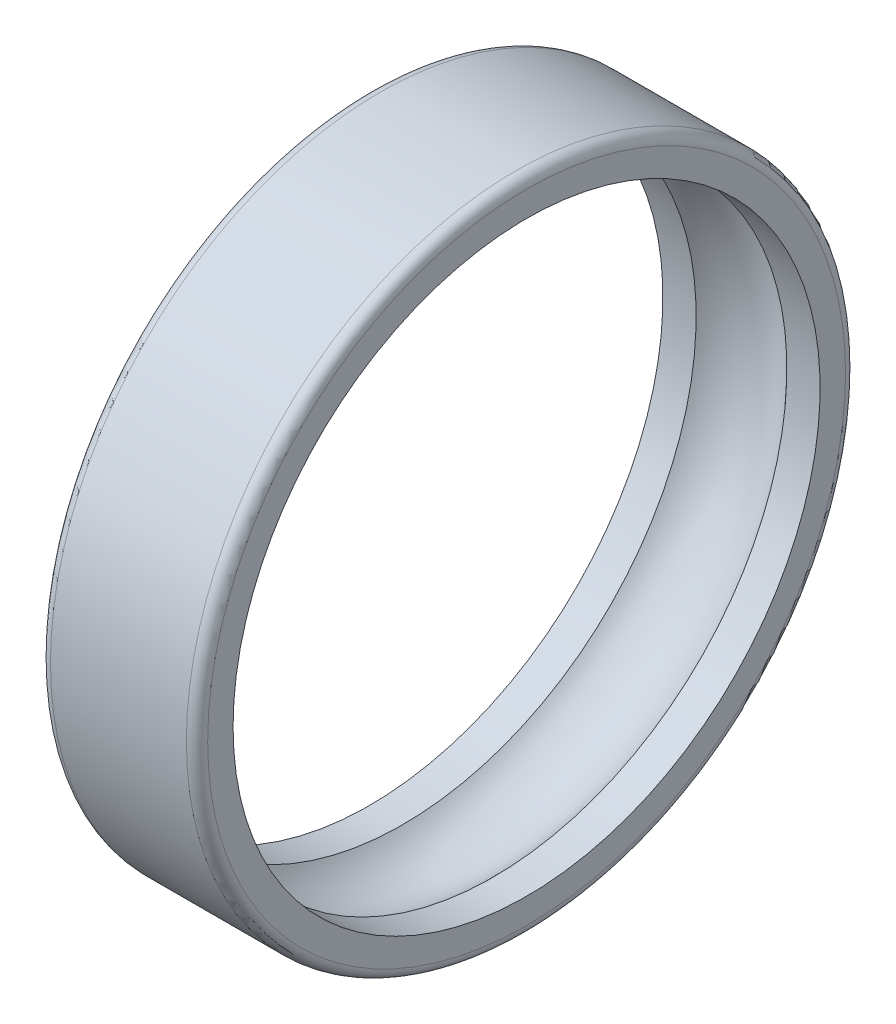
ISO-10303-21;
HEADER;
FILE_DESCRIPTION(('STEP AP214'),'2;1');
FILE_NAME('part.step','',(''),(''),'','','');
FILE_SCHEMA(('AUTOMOTIVE_DESIGN { 1 0 10303 214 1 1 1 1 }'));
ENDSEC;
DATA;
#1=APPLICATION_CONTEXT('core data for automotive mechanical design processes');
#2=APPLICATION_PROTOCOL_DEFINITION('international standard','automotive_design',2000,#1);
#3=PRODUCT_CONTEXT('',#1,'mechanical');
#4=PRODUCT('Part','Part','',(#3));
#5=PRODUCT_RELATED_PRODUCT_CATEGORY('part','',(#4));
#6=PRODUCT_DEFINITION_FORMATION('','',#4);
#7=PRODUCT_DEFINITION_CONTEXT('part definition',#1,'design');
#8=PRODUCT_DEFINITION('design','',#6,#7);
#9=PRODUCT_DEFINITION_SHAPE('','',#8);
#10=(LENGTH_UNIT() NAMED_UNIT(*) SI_UNIT(.MILLI.,.METRE.));
#11=(NAMED_UNIT(*) PLANE_ANGLE_UNIT() SI_UNIT($,.RADIAN.));
#12=(NAMED_UNIT(*) SI_UNIT($,.STERADIAN.) SOLID_ANGLE_UNIT());
#13=UNCERTAINTY_MEASURE_WITH_UNIT(LENGTH_MEASURE(1.E-05),#10,'distance_accuracy_value','');
#14=(GEOMETRIC_REPRESENTATION_CONTEXT(3) GLOBAL_UNCERTAINTY_ASSIGNED_CONTEXT((#13)) GLOBAL_UNIT_ASSIGNED_CONTEXT((#10,
#11,#12)) REPRESENTATION_CONTEXT('',''));
#15=CARTESIAN_POINT('',(0.,0.,0.));
#16=DIRECTION('',(0.,0.,1.));
#17=DIRECTION('',(1.,0.,0.));
#18=AXIS2_PLACEMENT_3D('',#15,#16,#17);
#19=CARTESIAN_POINT('',(-2.61888,9.7810944,0.));
#20=DIRECTION('',(1.,0.,0.));
#21=DIRECTION('',(0.,0.,-1.));
#22=AXIS2_PLACEMENT_3D('',#19,#20,#21);
#23=PLANE('',#22);
#24=CARTESIAN_POINT('',(-2.61888,0.,0.));
#25=DIRECTION('',(1.,0.,0.));
#26=DIRECTION('',(0.,0.,-1.));
#27=AXIS2_PLACEMENT_3D('',#24,#25,#26);
#28=CIRCLE('',#27,10.627584);
#29=CARTESIAN_POINT('',(-2.61888,0.,-10.627584));
#30=VERTEX_POINT('',#29);
#31=EDGE_CURVE('E10',#30,#30,#28,.F.);
#32=ORIENTED_EDGE('',*,*,#31,.T.);
#33=EDGE_LOOP('',(#32));
#34=FACE_BOUND('',#33,.T.);
#35=CARTESIAN_POINT('',(-2.61888,0.,0.));
#36=DIRECTION('',(-1.,0.,0.));
#37=DIRECTION('',(0.,0.,1.));
#38=AXIS2_PLACEMENT_3D('',#35,#36,#37);
#39=CIRCLE('',#38,9.7810944);
#40=CARTESIAN_POINT('',(-2.61888,0.,9.7810944));
#41=VERTEX_POINT('',#40);
#42=EDGE_CURVE('E66',#41,#41,#39,.T.);
#43=ORIENTED_EDGE('',*,*,#42,.F.);
#44=EDGE_LOOP('',(#43));
#45=FACE_BOUND('',#44,.T.);
#46=ADVANCED_FACE('F37',(#34,#45),#23,.F.);
#47=CARTESIAN_POINT('',(-15.6111811764706,0.,0.));
#48=DIRECTION('',(-1.,0.,0.));
#49=DIRECTION('',(0.,0.,1.));
#50=AXIS2_PLACEMENT_3D('',#47,#48,#49);
#51=CYLINDRICAL_SURFACE('',#50,10.9824);
#52=CARTESIAN_POINT('',(2.264064,0.,0.));
#53=DIRECTION('',(-1.,0.,0.));
#54=DIRECTION('',(0.,0.,1.));
#55=AXIS2_PLACEMENT_3D('',#52,#53,#54);
#56=CIRCLE('',#55,10.9824);
#57=CARTESIAN_POINT('',(2.264064,0.,10.9824));
#58=VERTEX_POINT('',#57);
#59=EDGE_CURVE('E48',#58,#58,#56,.T.);
#60=ORIENTED_EDGE('',*,*,#59,.T.);
#61=EDGE_LOOP('',(#60));
#62=FACE_BOUND('',#61,.T.);
#63=CARTESIAN_POINT('',(-2.264064,0.,0.));
#64=DIRECTION('',(1.,0.,0.));
#65=DIRECTION('',(0.,0.,-1.));
#66=AXIS2_PLACEMENT_3D('',#63,#64,#65);
#67=CIRCLE('',#66,10.9824);
#68=CARTESIAN_POINT('',(-2.264064,0.,-10.9824));
#69=VERTEX_POINT('',#68);
#70=EDGE_CURVE('E52',#69,#69,#67,.T.);
#71=ORIENTED_EDGE('',*,*,#70,.T.);
#72=EDGE_LOOP('',(#71));
#73=FACE_BOUND('',#72,.T.);
#74=ADVANCED_FACE('F73',(#62,#73),#51,.T.);
#75=CARTESIAN_POINT('',(2.61888,9.7810944,0.));
#76=DIRECTION('',(-1.,0.,0.));
#77=DIRECTION('',(0.,0.,1.));
#78=AXIS2_PLACEMENT_3D('',#75,#76,#77);
#79=PLANE('',#78);
#80=CARTESIAN_POINT('',(2.61888,0.,0.));
#81=DIRECTION('',(-1.,0.,0.));
#82=DIRECTION('',(0.,0.,1.));
#83=AXIS2_PLACEMENT_3D('',#80,#81,#82);
#84=CIRCLE('',#83,10.627584);
#85=CARTESIAN_POINT('',(2.61888,0.,10.627584));
#86=VERTEX_POINT('',#85);
#87=EDGE_CURVE('E44',#86,#86,#84,.F.);
#88=ORIENTED_EDGE('',*,*,#87,.T.);
#89=EDGE_LOOP('',(#88));
#90=FACE_BOUND('',#89,.T.);
#91=CARTESIAN_POINT('',(2.61888,0.,0.));
#92=DIRECTION('',(-1.,0.,0.));
#93=DIRECTION('',(0.,0.,1.));
#94=AXIS2_PLACEMENT_3D('',#91,#92,#93);
#95=CIRCLE('',#94,9.7810944);
#96=CARTESIAN_POINT('',(2.61888,0.,9.7810944));
#97=VERTEX_POINT('',#96);
#98=EDGE_CURVE('E57',#97,#97,#95,.T.);
#99=ORIENTED_EDGE('',*,*,#98,.T.);
#100=EDGE_LOOP('',(#99));
#101=FACE_BOUND('',#100,.T.);
#102=ADVANCED_FACE('F78',(#90,#101),#79,.F.);
#103=CARTESIAN_POINT('',(-15.6111811764706,0.,0.));
#104=DIRECTION('',(-1.,0.,0.));
#105=DIRECTION('',(0.,0.,1.));
#106=AXIS2_PLACEMENT_3D('',#103,#104,#105);
#107=CYLINDRICAL_SURFACE('',#106,9.7810944);
#108=ORIENTED_EDGE('',*,*,#98,.F.);
#109=EDGE_LOOP('',(#108));
#110=FACE_BOUND('',#109,.T.);
#111=CARTESIAN_POINT('',(1.51122418191346,0.,0.));
#112=DIRECTION('',(-1.,0.,0.));
#113=DIRECTION('',(0.,0.,1.));
#114=AXIS2_PLACEMENT_3D('',#111,#112,#113);
#115=CIRCLE('',#114,9.7810944);
#116=CARTESIAN_POINT('',(1.51122418191346,0.,9.7810944));
#117=VERTEX_POINT('',#116);
#118=EDGE_CURVE('E60',#117,#117,#115,.T.);
#119=ORIENTED_EDGE('',*,*,#118,.T.);
#120=EDGE_LOOP('',(#119));
#121=FACE_BOUND('',#120,.T.);
#122=ADVANCED_FACE('F101',(#110,#121),#107,.F.);
#123=CARTESIAN_POINT('',(0.,0.,0.));
#124=DIRECTION('',(-1.,0.,0.));
#125=DIRECTION('',(0.,0.,1.));
#126=AXIS2_PLACEMENT_3D('',#123,#124,#125);
#127=TOROIDAL_SURFACE('',#126,8.4294144,2.02752);
#128=ORIENTED_EDGE('',*,*,#118,.F.);
#129=EDGE_LOOP('',(#128));
#130=FACE_BOUND('',#129,.T.);
#131=CARTESIAN_POINT('',(-1.51122418191346,0.,0.));
#132=DIRECTION('',(-1.,0.,0.));
#133=DIRECTION('',(0.,0.,1.));
#134=AXIS2_PLACEMENT_3D('',#131,#132,#133);
#135=CIRCLE('',#134,9.7810944);
#136=CARTESIAN_POINT('',(-1.51122418191346,0.,9.7810944));
#137=VERTEX_POINT('',#136);
#138=EDGE_CURVE('E63',#137,#137,#135,.T.);
#139=ORIENTED_EDGE('',*,*,#138,.T.);
#140=EDGE_LOOP('',(#139));
#141=FACE_BOUND('',#140,.T.);
#142=ADVANCED_FACE('F90',(#130,#141),#127,.F.);
#143=CARTESIAN_POINT('',(-15.6111811764706,0.,0.));
#144=DIRECTION('',(-1.,0.,0.));
#145=DIRECTION('',(0.,0.,1.));
#146=AXIS2_PLACEMENT_3D('',#143,#144,#145);
#147=CYLINDRICAL_SURFACE('',#146,9.7810944);
#148=ORIENTED_EDGE('',*,*,#138,.F.);
#149=EDGE_LOOP('',(#148));
#150=FACE_BOUND('',#149,.T.);
#151=ORIENTED_EDGE('',*,*,#42,.T.);
#152=EDGE_LOOP('',(#151));
#153=FACE_BOUND('',#152,.T.);
#154=ADVANCED_FACE('F70',(#150,#153),#147,.F.);
#155=CARTESIAN_POINT('',(2.264064,0.,0.));
#156=DIRECTION('',(-1.,0.,0.));
#157=DIRECTION('',(0.,0.,1.));
#158=AXIS2_PLACEMENT_3D('',#155,#156,#157);
#159=TOROIDAL_SURFACE('',#158,10.627584,0.354816);
#160=ORIENTED_EDGE('',*,*,#87,.F.);
#161=EDGE_LOOP('',(#160));
#162=FACE_BOUND('',#161,.T.);
#163=ORIENTED_EDGE('',*,*,#59,.F.);
#164=EDGE_LOOP('',(#163));
#165=FACE_BOUND('',#164,.T.);
#166=ADVANCED_FACE('F82',(#162,#165),#159,.T.);
#167=CARTESIAN_POINT('',(-2.264064,0.,0.));
#168=DIRECTION('',(1.,0.,0.));
#169=DIRECTION('',(0.,0.,-1.));
#170=AXIS2_PLACEMENT_3D('',#167,#168,#169);
#171=TOROIDAL_SURFACE('',#170,10.627584,0.354816);
#172=ORIENTED_EDGE('',*,*,#70,.F.);
#173=EDGE_LOOP('',(#172));
#174=FACE_BOUND('',#173,.T.);
#175=ORIENTED_EDGE('',*,*,#31,.F.);
#176=EDGE_LOOP('',(#175));
#177=FACE_BOUND('',#176,.T.);
#178=ADVANCED_FACE('F39',(#174,#177),#171,.T.);
#179=CLOSED_SHELL('',(#46,#74,#102,#122,#142,#154,#166,#178));
#180=MANIFOLD_SOLID_BREP('B2',#179);
#181=ADVANCED_BREP_SHAPE_REPRESENTATION('',(#18,#180),#14);
#182=SHAPE_DEFINITION_REPRESENTATION(#9,#181);
ENDSEC;
END-ISO-10303-21;
